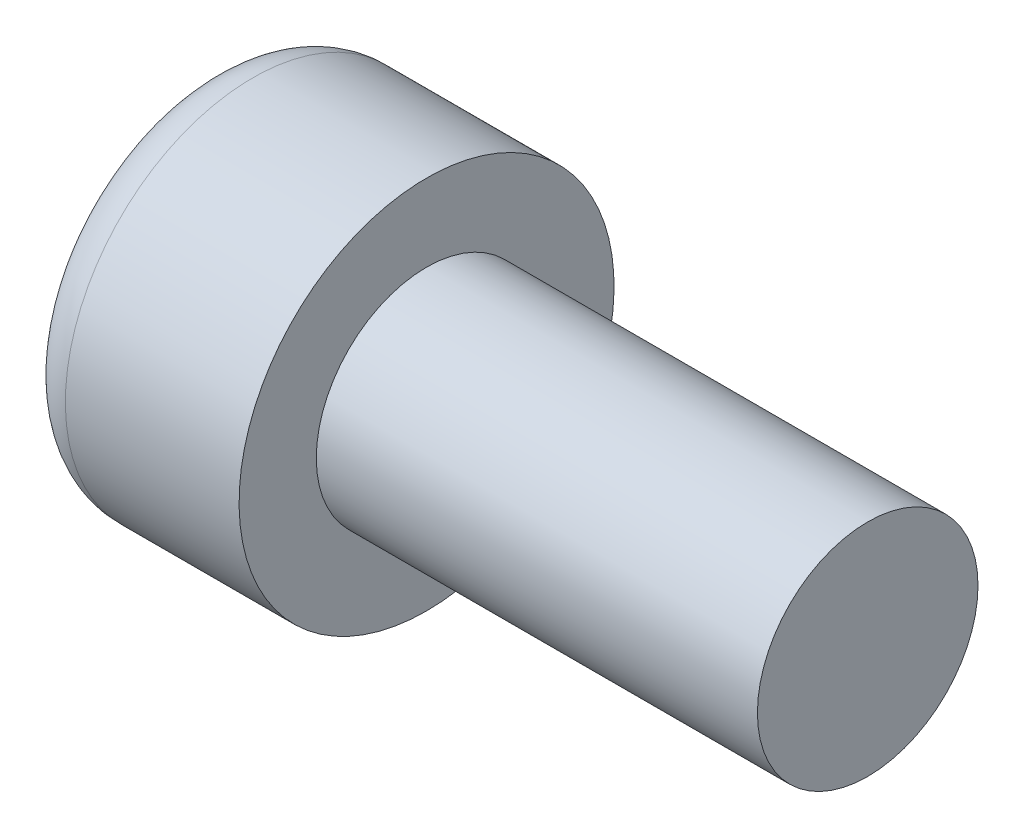
ISO-10303-21;
HEADER;
FILE_DESCRIPTION(('STEP AP214'),'2;1');
FILE_NAME('part.step','',(''),(''),'','','');
FILE_SCHEMA(('AUTOMOTIVE_DESIGN { 1 0 10303 214 1 1 1 1 }'));
ENDSEC;
DATA;
#1=APPLICATION_CONTEXT('core data for automotive mechanical design processes');
#2=APPLICATION_PROTOCOL_DEFINITION('international standard','automotive_design',2000,#1);
#3=PRODUCT_CONTEXT('',#1,'mechanical');
#4=PRODUCT('Part','Part','',(#3));
#5=PRODUCT_RELATED_PRODUCT_CATEGORY('part','',(#4));
#6=PRODUCT_DEFINITION_FORMATION('','',#4);
#7=PRODUCT_DEFINITION_CONTEXT('part definition',#1,'design');
#8=PRODUCT_DEFINITION('design','',#6,#7);
#9=PRODUCT_DEFINITION_SHAPE('','',#8);
#10=(LENGTH_UNIT() NAMED_UNIT(*) SI_UNIT(.MILLI.,.METRE.));
#11=(NAMED_UNIT(*) PLANE_ANGLE_UNIT() SI_UNIT($,.RADIAN.));
#12=(NAMED_UNIT(*) SI_UNIT($,.STERADIAN.) SOLID_ANGLE_UNIT());
#13=UNCERTAINTY_MEASURE_WITH_UNIT(LENGTH_MEASURE(1.E-05),#10,'distance_accuracy_value','');
#14=(GEOMETRIC_REPRESENTATION_CONTEXT(3) GLOBAL_UNCERTAINTY_ASSIGNED_CONTEXT((#13)) GLOBAL_UNIT_ASSIGNED_CONTEXT((#10,
#11,#12)) REPRESENTATION_CONTEXT('',''));
#15=CARTESIAN_POINT('',(0.,0.,0.));
#16=DIRECTION('',(0.,0.,1.));
#17=DIRECTION('',(1.,0.,0.));
#18=AXIS2_PLACEMENT_3D('',#15,#16,#17);
#19=CARTESIAN_POINT('',(0.,0.,0.));
#20=DIRECTION('',(1.,0.,0.));
#21=DIRECTION('',(0.,1.,0.));
#22=AXIS2_PLACEMENT_3D('',#19,#20,#21);
#23=PLANE('',#22);
#24=DIRECTION('',(0.,-0.5,-0.866025403784439));
#25=VECTOR('',#24,1.);
#26=CARTESIAN_POINT('',(0.,2.3094010767585,0.));
#27=LINE('',#26,#25);
#28=CARTESIAN_POINT('',(0.,2.3094010767585,0.));
#29=VERTEX_POINT('',#28);
#30=CARTESIAN_POINT('',(0.,1.15470053837925,-2.));
#31=VERTEX_POINT('',#30);
#32=EDGE_CURVE('E121',#29,#31,#27,.T.);
#33=ORIENTED_EDGE('',*,*,#32,.F.);
#34=DIRECTION('',(0.,0.5,-0.866025403784439));
#35=VECTOR('',#34,1.);
#36=CARTESIAN_POINT('',(0.,1.15470053837925,2.));
#37=LINE('',#36,#35);
#38=CARTESIAN_POINT('',(0.,1.15470053837925,2.));
#39=VERTEX_POINT('',#38);
#40=EDGE_CURVE('E47',#39,#29,#37,.T.);
#41=ORIENTED_EDGE('',*,*,#40,.F.);
#42=DIRECTION('',(0.,1.,0.));
#43=VECTOR('',#42,1.);
#44=CARTESIAN_POINT('',(0.,-1.15470053837925,2.));
#45=LINE('',#44,#43);
#46=CARTESIAN_POINT('',(0.,-1.15470053837925,2.));
#47=VERTEX_POINT('',#46);
#48=EDGE_CURVE('E130',#47,#39,#45,.T.);
#49=ORIENTED_EDGE('',*,*,#48,.F.);
#50=DIRECTION('',(0.,0.5,0.866025403784439));
#51=VECTOR('',#50,1.);
#52=CARTESIAN_POINT('',(0.,-2.3094010767585,0.));
#53=LINE('',#52,#51);
#54=CARTESIAN_POINT('',(0.,-2.3094010767585,0.));
#55=VERTEX_POINT('',#54);
#56=EDGE_CURVE('E128',#55,#47,#53,.T.);
#57=ORIENTED_EDGE('',*,*,#56,.F.);
#58=DIRECTION('',(0.,-0.5,0.866025403784439));
#59=VECTOR('',#58,1.);
#60=CARTESIAN_POINT('',(0.,-1.15470053837925,-2.));
#61=LINE('',#60,#59);
#62=CARTESIAN_POINT('',(0.,-1.15470053837925,-2.));
#63=VERTEX_POINT('',#62);
#64=EDGE_CURVE('E95',#63,#55,#61,.T.);
#65=ORIENTED_EDGE('',*,*,#64,.F.);
#66=DIRECTION('',(0.,-1.,0.));
#67=VECTOR('',#66,1.);
#68=CARTESIAN_POINT('',(0.,1.15470053837925,-2.));
#69=LINE('',#68,#67);
#70=EDGE_CURVE('E124',#31,#63,#69,.T.);
#71=ORIENTED_EDGE('',*,*,#70,.F.);
#72=EDGE_LOOP('',(#33,#41,#49,#57,#65,#71));
#73=FACE_BOUND('',#72,.T.);
#74=CARTESIAN_POINT('',(0.,0.,0.));
#75=DIRECTION('',(-1.,0.,0.));
#76=DIRECTION('',(0.,-1.,0.));
#77=AXIS2_PLACEMENT_3D('',#74,#75,#76);
#78=CIRCLE('',#77,3.1875);
#79=CARTESIAN_POINT('',(0.,-3.1875,0.));
#80=VERTEX_POINT('',#79);
#81=EDGE_CURVE('E11',#80,#80,#78,.T.);
#82=ORIENTED_EDGE('',*,*,#81,.T.);
#83=EDGE_LOOP('',(#82));
#84=FACE_BOUND('',#83,.T.);
#85=ADVANCED_FACE('F33',(#73,#84),#23,.F.);
#86=CARTESIAN_POINT('',(1.0625,0.,0.));
#87=DIRECTION('',(-1.,0.,0.));
#88=DIRECTION('',(0.,-1.,0.));
#89=AXIS2_PLACEMENT_3D('',#86,#87,#88);
#90=TOROIDAL_SURFACE('',#89,3.1875,1.0625);
#91=ORIENTED_EDGE('',*,*,#81,.F.);
#92=EDGE_LOOP('',(#91));
#93=FACE_BOUND('',#92,.T.);
#94=CARTESIAN_POINT('',(1.0625,0.,0.));
#95=DIRECTION('',(-1.,0.,0.));
#96=DIRECTION('',(0.,-1.,0.));
#97=AXIS2_PLACEMENT_3D('',#94,#95,#96);
#98=CIRCLE('',#97,4.25);
#99=CARTESIAN_POINT('',(1.0625,-4.25,0.));
#100=VERTEX_POINT('',#99);
#101=EDGE_CURVE('E40',#100,#100,#98,.T.);
#102=ORIENTED_EDGE('',*,*,#101,.T.);
#103=EDGE_LOOP('',(#102));
#104=FACE_BOUND('',#103,.T.);
#105=ADVANCED_FACE('F150',(#93,#104),#90,.T.);
#106=CARTESIAN_POINT('',(0.,0.,0.));
#107=DIRECTION('',(-1.,0.,0.));
#108=DIRECTION('',(0.,-1.,0.));
#109=AXIS2_PLACEMENT_3D('',#106,#107,#108);
#110=CYLINDRICAL_SURFACE('',#109,4.25);
#111=ORIENTED_EDGE('',*,*,#101,.F.);
#112=EDGE_LOOP('',(#111));
#113=FACE_BOUND('',#112,.T.);
#114=CARTESIAN_POINT('',(5.,0.,0.));
#115=DIRECTION('',(-1.,0.,0.));
#116=DIRECTION('',(0.,-1.,0.));
#117=AXIS2_PLACEMENT_3D('',#114,#115,#116);
#118=CIRCLE('',#117,4.25);
#119=CARTESIAN_POINT('',(5.,-4.25,0.));
#120=VERTEX_POINT('',#119);
#121=EDGE_CURVE('E145',#120,#120,#118,.T.);
#122=ORIENTED_EDGE('',*,*,#121,.T.);
#123=EDGE_LOOP('',(#122));
#124=FACE_BOUND('',#123,.T.);
#125=ADVANCED_FACE('F152',(#113,#124),#110,.T.);
#126=CARTESIAN_POINT('',(5.,4.25,0.));
#127=DIRECTION('',(-1.,0.,0.));
#128=DIRECTION('',(0.,-1.,0.));
#129=AXIS2_PLACEMENT_3D('',#126,#127,#128);
#130=PLANE('',#129);
#131=ORIENTED_EDGE('',*,*,#121,.F.);
#132=EDGE_LOOP('',(#131));
#133=FACE_BOUND('',#132,.T.);
#134=CARTESIAN_POINT('',(5.,0.,0.));
#135=DIRECTION('',(-1.,0.,0.));
#136=DIRECTION('',(0.,-1.,0.));
#137=AXIS2_PLACEMENT_3D('',#134,#135,#136);
#138=CIRCLE('',#137,2.5);
#139=CARTESIAN_POINT('',(5.,-2.5,0.));
#140=VERTEX_POINT('',#139);
#141=EDGE_CURVE('E142',#140,#140,#138,.T.);
#142=ORIENTED_EDGE('',*,*,#141,.T.);
#143=EDGE_LOOP('',(#142));
#144=FACE_BOUND('',#143,.T.);
#145=ADVANCED_FACE('F155',(#133,#144),#130,.F.);
#146=CARTESIAN_POINT('',(0.,0.,0.));
#147=DIRECTION('',(-1.,0.,0.));
#148=DIRECTION('',(0.,-1.,0.));
#149=AXIS2_PLACEMENT_3D('',#146,#147,#148);
#150=CYLINDRICAL_SURFACE('',#149,2.5);
#151=ORIENTED_EDGE('',*,*,#141,.F.);
#152=EDGE_LOOP('',(#151));
#153=FACE_BOUND('',#152,.T.);
#154=CARTESIAN_POINT('',(15.,0.,0.));
#155=DIRECTION('',(-1.,0.,0.));
#156=DIRECTION('',(0.,-1.,0.));
#157=AXIS2_PLACEMENT_3D('',#154,#155,#156);
#158=CIRCLE('',#157,2.5);
#159=CARTESIAN_POINT('',(15.,-2.49999999999999,0.));
#160=VERTEX_POINT('',#159);
#161=EDGE_CURVE('E134',#160,#160,#158,.T.);
#162=ORIENTED_EDGE('',*,*,#161,.T.);
#163=EDGE_LOOP('',(#162));
#164=FACE_BOUND('',#163,.T.);
#165=ADVANCED_FACE('F161',(#153,#164),#150,.T.);
#166=CARTESIAN_POINT('',(15.,2.5,0.));
#167=DIRECTION('',(-1.,0.,0.));
#168=DIRECTION('',(0.,-1.,0.));
#169=AXIS2_PLACEMENT_3D('',#166,#167,#168);
#170=PLANE('',#169);
#171=ORIENTED_EDGE('',*,*,#161,.F.);
#172=EDGE_LOOP('',(#171));
#173=FACE_BOUND('',#172,.T.);
#174=ADVANCED_FACE('F167',(#173),#170,.F.);
#175=CARTESIAN_POINT('',(2.5,1.15470053837925,2.));
#176=DIRECTION('',(0.,0.866025403784439,0.5));
#177=DIRECTION('',(0.,-0.5,0.866025403784439));
#178=AXIS2_PLACEMENT_3D('',#175,#176,#177);
#179=PLANE('',#178);
#180=ORIENTED_EDGE('',*,*,#40,.T.);
#181=DIRECTION('',(-1.,0.,0.));
#182=VECTOR('',#181,1.);
#183=CARTESIAN_POINT('',(2.5,2.3094010767585,0.));
#184=LINE('',#183,#182);
#185=CARTESIAN_POINT('',(2.5,2.3094010767585,0.));
#186=VERTEX_POINT('',#185);
#187=EDGE_CURVE('E77',#186,#29,#184,.T.);
#188=ORIENTED_EDGE('',*,*,#187,.F.);
#189=DIRECTION('',(0.,0.5,-0.866025403784439));
#190=VECTOR('',#189,1.);
#191=CARTESIAN_POINT('',(2.5,1.15470053837925,2.));
#192=LINE('',#191,#190);
#193=CARTESIAN_POINT('',(2.5,1.15470053837925,2.));
#194=VERTEX_POINT('',#193);
#195=EDGE_CURVE('E132',#194,#186,#192,.T.);
#196=ORIENTED_EDGE('',*,*,#195,.F.);
#197=DIRECTION('',(-1.,0.,0.));
#198=VECTOR('',#197,1.);
#199=CARTESIAN_POINT('',(2.5,1.15470053837925,2.));
#200=LINE('',#199,#198);
#201=EDGE_CURVE('E55',#194,#39,#200,.T.);
#202=ORIENTED_EDGE('',*,*,#201,.T.);
#203=EDGE_LOOP('',(#180,#188,#196,#202));
#204=FACE_BOUND('',#203,.T.);
#205=ADVANCED_FACE('F172',(#204),#179,.F.);
#206=CARTESIAN_POINT('',(2.5,-1.15470053837925,2.));
#207=DIRECTION('',(0.,0.,1.));
#208=DIRECTION('',(1.,0.,0.));
#209=AXIS2_PLACEMENT_3D('',#206,#207,#208);
#210=PLANE('',#209);
#211=ORIENTED_EDGE('',*,*,#48,.T.);
#212=ORIENTED_EDGE('',*,*,#201,.F.);
#213=DIRECTION('',(0.,1.,0.));
#214=VECTOR('',#213,1.);
#215=CARTESIAN_POINT('',(2.5,-1.15470053837925,2.));
#216=LINE('',#215,#214);
#217=CARTESIAN_POINT('',(2.5,-1.15470053837925,2.));
#218=VERTEX_POINT('',#217);
#219=EDGE_CURVE('E107',#218,#194,#216,.T.);
#220=ORIENTED_EDGE('',*,*,#219,.F.);
#221=DIRECTION('',(-1.,0.,0.));
#222=VECTOR('',#221,1.);
#223=CARTESIAN_POINT('',(2.5,-1.15470053837925,2.));
#224=LINE('',#223,#222);
#225=EDGE_CURVE('E99',#218,#47,#224,.T.);
#226=ORIENTED_EDGE('',*,*,#225,.T.);
#227=EDGE_LOOP('',(#211,#212,#220,#226));
#228=FACE_BOUND('',#227,.T.);
#229=ADVANCED_FACE('F177',(#228),#210,.F.);
#230=CARTESIAN_POINT('',(2.5,-2.3094010767585,0.));
#231=DIRECTION('',(0.,-0.866025403784439,0.5));
#232=DIRECTION('',(0.,-0.5,-0.866025403784439));
#233=AXIS2_PLACEMENT_3D('',#230,#231,#232);
#234=PLANE('',#233);
#235=ORIENTED_EDGE('',*,*,#56,.T.);
#236=ORIENTED_EDGE('',*,*,#225,.F.);
#237=DIRECTION('',(0.,0.5,0.866025403784439));
#238=VECTOR('',#237,1.);
#239=CARTESIAN_POINT('',(2.5,-2.3094010767585,0.));
#240=LINE('',#239,#238);
#241=CARTESIAN_POINT('',(2.5,-2.3094010767585,0.));
#242=VERTEX_POINT('',#241);
#243=EDGE_CURVE('E103',#242,#218,#240,.T.);
#244=ORIENTED_EDGE('',*,*,#243,.F.);
#245=DIRECTION('',(-1.,0.,0.));
#246=VECTOR('',#245,1.);
#247=CARTESIAN_POINT('',(2.5,-2.3094010767585,0.));
#248=LINE('',#247,#246);
#249=EDGE_CURVE('E88',#242,#55,#248,.T.);
#250=ORIENTED_EDGE('',*,*,#249,.T.);
#251=EDGE_LOOP('',(#235,#236,#244,#250));
#252=FACE_BOUND('',#251,.T.);
#253=ADVANCED_FACE('F104',(#252),#234,.F.);
#254=CARTESIAN_POINT('',(2.5,-1.15470053837925,-2.));
#255=DIRECTION('',(0.,-0.866025403784438,-0.5));
#256=DIRECTION('',(0.,0.5,-0.866025403784438));
#257=AXIS2_PLACEMENT_3D('',#254,#255,#256);
#258=PLANE('',#257);
#259=ORIENTED_EDGE('',*,*,#64,.T.);
#260=ORIENTED_EDGE('',*,*,#249,.F.);
#261=DIRECTION('',(0.,-0.5,0.866025403784439));
#262=VECTOR('',#261,1.);
#263=CARTESIAN_POINT('',(2.5,-1.15470053837925,-2.));
#264=LINE('',#263,#262);
#265=CARTESIAN_POINT('',(2.5,-1.15470053837925,-2.));
#266=VERTEX_POINT('',#265);
#267=EDGE_CURVE('E92',#266,#242,#264,.T.);
#268=ORIENTED_EDGE('',*,*,#267,.F.);
#269=DIRECTION('',(-1.,0.,0.));
#270=VECTOR('',#269,1.);
#271=CARTESIAN_POINT('',(2.5,-1.15470053837925,-2.));
#272=LINE('',#271,#270);
#273=EDGE_CURVE('E100',#266,#63,#272,.T.);
#274=ORIENTED_EDGE('',*,*,#273,.T.);
#275=EDGE_LOOP('',(#259,#260,#268,#274));
#276=FACE_BOUND('',#275,.T.);
#277=ADVANCED_FACE('F90',(#276),#258,.F.);
#278=CARTESIAN_POINT('',(2.5,1.15470053837925,-2.));
#279=DIRECTION('',(0.,0.,-1.));
#280=DIRECTION('',(-1.,0.,0.));
#281=AXIS2_PLACEMENT_3D('',#278,#279,#280);
#282=PLANE('',#281);
#283=ORIENTED_EDGE('',*,*,#70,.T.);
#284=ORIENTED_EDGE('',*,*,#273,.F.);
#285=DIRECTION('',(0.,-1.,0.));
#286=VECTOR('',#285,1.);
#287=CARTESIAN_POINT('',(2.5,1.15470053837925,-2.));
#288=LINE('',#287,#286);
#289=CARTESIAN_POINT('',(2.5,1.15470053837925,-2.));
#290=VERTEX_POINT('',#289);
#291=EDGE_CURVE('E113',#290,#266,#288,.T.);
#292=ORIENTED_EDGE('',*,*,#291,.F.);
#293=DIRECTION('',(-1.,0.,0.));
#294=VECTOR('',#293,1.);
#295=CARTESIAN_POINT('',(2.5,1.15470053837925,-2.));
#296=LINE('',#295,#294);
#297=EDGE_CURVE('E137',#290,#31,#296,.T.);
#298=ORIENTED_EDGE('',*,*,#297,.T.);
#299=EDGE_LOOP('',(#283,#284,#292,#298));
#300=FACE_BOUND('',#299,.T.);
#301=ADVANCED_FACE('F203',(#300),#282,.F.);
#302=CARTESIAN_POINT('',(2.5,2.3094010767585,0.));
#303=DIRECTION('',(0.,0.866025403784439,-0.5));
#304=DIRECTION('',(0.,0.5,0.866025403784439));
#305=AXIS2_PLACEMENT_3D('',#302,#303,#304);
#306=PLANE('',#305);
#307=ORIENTED_EDGE('',*,*,#32,.T.);
#308=ORIENTED_EDGE('',*,*,#297,.F.);
#309=DIRECTION('',(0.,-0.5,-0.866025403784439));
#310=VECTOR('',#309,1.);
#311=CARTESIAN_POINT('',(2.5,2.3094010767585,0.));
#312=LINE('',#311,#310);
#313=EDGE_CURVE('E115',#186,#290,#312,.T.);
#314=ORIENTED_EDGE('',*,*,#313,.F.);
#315=ORIENTED_EDGE('',*,*,#187,.T.);
#316=EDGE_LOOP('',(#307,#308,#314,#315));
#317=FACE_BOUND('',#316,.T.);
#318=ADVANCED_FACE('F191',(#317),#306,.F.);
#319=CARTESIAN_POINT('',(2.5,0.,0.));
#320=DIRECTION('',(-1.,0.,0.));
#321=DIRECTION('',(0.,-1.,0.));
#322=AXIS2_PLACEMENT_3D('',#319,#320,#321);
#323=PLANE('',#322);
#324=ORIENTED_EDGE('',*,*,#195,.T.);
#325=ORIENTED_EDGE('',*,*,#313,.T.);
#326=ORIENTED_EDGE('',*,*,#291,.T.);
#327=ORIENTED_EDGE('',*,*,#267,.T.);
#328=ORIENTED_EDGE('',*,*,#243,.T.);
#329=ORIENTED_EDGE('',*,*,#219,.T.);
#330=EDGE_LOOP('',(#324,#325,#326,#327,#328,#329));
#331=FACE_BOUND('',#330,.T.);
#332=ADVANCED_FACE('F110',(#331),#323,.T.);
#333=CLOSED_SHELL('',(#85,#105,#125,#145,#165,#174,#205,#229,#253,#277,#301,#318,#332));
#334=MANIFOLD_SOLID_BREP('B2',#333);
#335=ADVANCED_BREP_SHAPE_REPRESENTATION('',(#18,#334),#14);
#336=SHAPE_DEFINITION_REPRESENTATION(#9,#335);
ENDSEC;
END-ISO-10303-21;
